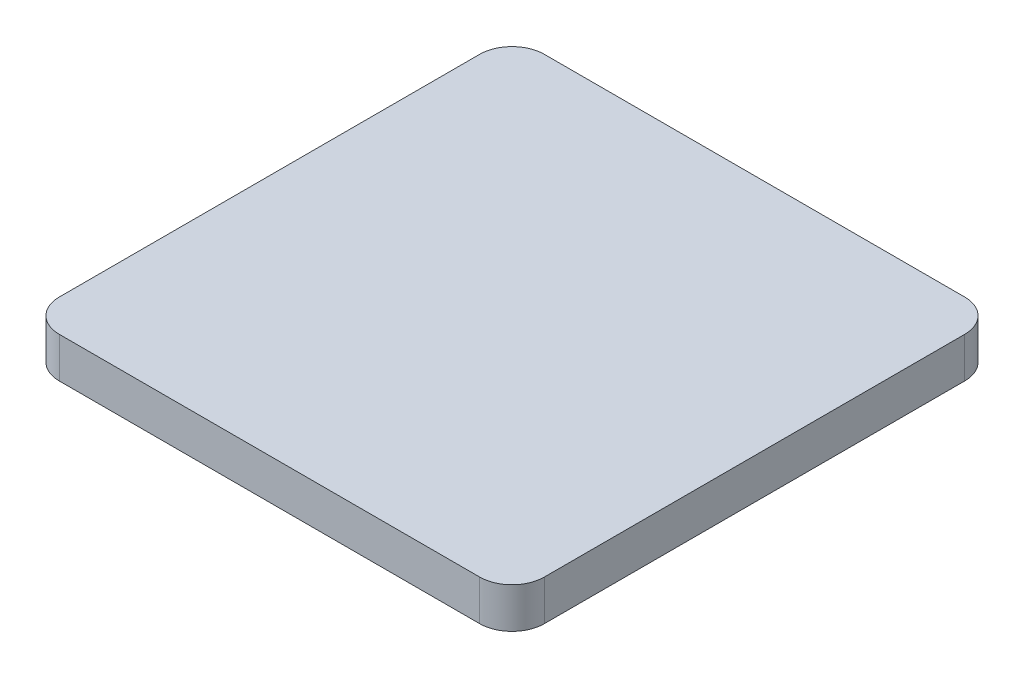
ISO-10303-21;
HEADER;
FILE_DESCRIPTION(('STEP AP214'),'2;1');
FILE_NAME('part.step','',(''),(''),'','','');
FILE_SCHEMA(('AUTOMOTIVE_DESIGN { 1 0 10303 214 1 1 1 1 }'));
ENDSEC;
DATA;
#1=APPLICATION_CONTEXT('core data for automotive mechanical design processes');
#2=APPLICATION_PROTOCOL_DEFINITION('international standard','automotive_design',2000,#1);
#3=PRODUCT_CONTEXT('',#1,'mechanical');
#4=PRODUCT('Part','Part','',(#3));
#5=PRODUCT_RELATED_PRODUCT_CATEGORY('part','',(#4));
#6=PRODUCT_DEFINITION_FORMATION('','',#4);
#7=PRODUCT_DEFINITION_CONTEXT('part definition',#1,'design');
#8=PRODUCT_DEFINITION('design','',#6,#7);
#9=PRODUCT_DEFINITION_SHAPE('','',#8);
#10=(LENGTH_UNIT() NAMED_UNIT(*) SI_UNIT(.MILLI.,.METRE.));
#11=(NAMED_UNIT(*) PLANE_ANGLE_UNIT() SI_UNIT($,.RADIAN.));
#12=(NAMED_UNIT(*) SI_UNIT($,.STERADIAN.) SOLID_ANGLE_UNIT());
#13=UNCERTAINTY_MEASURE_WITH_UNIT(LENGTH_MEASURE(1.E-05),#10,'distance_accuracy_value','');
#14=(GEOMETRIC_REPRESENTATION_CONTEXT(3) GLOBAL_UNCERTAINTY_ASSIGNED_CONTEXT((#13)) GLOBAL_UNIT_ASSIGNED_CONTEXT((#10,
#11,#12)) REPRESENTATION_CONTEXT('',''));
#15=CARTESIAN_POINT('',(0.,0.,0.));
#16=DIRECTION('',(0.,0.,1.));
#17=DIRECTION('',(1.,0.,0.));
#18=AXIS2_PLACEMENT_3D('',#15,#16,#17);
#19=CARTESIAN_POINT('',(-60.,10.,-60.));
#20=DIRECTION('',(1.,0.,0.));
#21=DIRECTION('',(0.,0.,-1.));
#22=AXIS2_PLACEMENT_3D('',#19,#20,#21);
#23=PLANE('',#22);
#24=DIRECTION('',(0.,0.,1.));
#25=VECTOR('',#24,1.);
#26=CARTESIAN_POINT('',(-60.,10.,-60.));
#27=LINE('',#26,#25);
#28=CARTESIAN_POINT('',(-60.,10.,-52.));
#29=VERTEX_POINT('',#28);
#30=CARTESIAN_POINT('',(-60.,10.,52.));
#31=VERTEX_POINT('',#30);
#32=EDGE_CURVE('E120',#29,#31,#27,.T.);
#33=ORIENTED_EDGE('',*,*,#32,.F.);
#34=DIRECTION('',(0.,-1.,0.));
#35=VECTOR('',#34,1.);
#36=CARTESIAN_POINT('',(-60.,10.,-52.));
#37=LINE('',#36,#35);
#38=CARTESIAN_POINT('',(-60.,0.,-52.));
#39=VERTEX_POINT('',#38);
#40=EDGE_CURVE('E105',#29,#39,#37,.T.);
#41=ORIENTED_EDGE('',*,*,#40,.T.);
#42=DIRECTION('',(0.,0.,1.));
#43=VECTOR('',#42,1.);
#44=CARTESIAN_POINT('',(-60.,0.,-60.));
#45=LINE('',#44,#43);
#46=CARTESIAN_POINT('',(-60.,0.,52.));
#47=VERTEX_POINT('',#46);
#48=EDGE_CURVE('E117',#39,#47,#45,.T.);
#49=ORIENTED_EDGE('',*,*,#48,.T.);
#50=DIRECTION('',(0.,-1.,0.));
#51=VECTOR('',#50,1.);
#52=CARTESIAN_POINT('',(-60.,10.,52.));
#53=LINE('',#52,#51);
#54=EDGE_CURVE('E122',#47,#31,#53,.F.);
#55=ORIENTED_EDGE('',*,*,#54,.T.);
#56=EDGE_LOOP('',(#33,#41,#49,#55));
#57=FACE_BOUND('',#56,.T.);
#58=ADVANCED_FACE('F35',(#57),#23,.F.);
#59=CARTESIAN_POINT('',(60.,10.,60.));
#60=DIRECTION('',(0.,0.,-1.));
#61=DIRECTION('',(-1.,0.,0.));
#62=AXIS2_PLACEMENT_3D('',#59,#60,#61);
#63=PLANE('',#62);
#64=DIRECTION('',(1.,0.,0.));
#65=VECTOR('',#64,1.);
#66=CARTESIAN_POINT('',(60.,0.,60.));
#67=LINE('',#66,#65);
#68=CARTESIAN_POINT('',(-52.,0.,60.));
#69=VERTEX_POINT('',#68);
#70=CARTESIAN_POINT('',(52.,0.,60.));
#71=VERTEX_POINT('',#70);
#72=EDGE_CURVE('E126',#69,#71,#67,.T.);
#73=ORIENTED_EDGE('',*,*,#72,.T.);
#74=DIRECTION('',(0.,-1.,0.));
#75=VECTOR('',#74,1.);
#76=CARTESIAN_POINT('',(52.,10.,60.));
#77=LINE('',#76,#75);
#78=CARTESIAN_POINT('',(52.,10.,60.));
#79=VERTEX_POINT('',#78);
#80=EDGE_CURVE('E11',#71,#79,#77,.F.);
#81=ORIENTED_EDGE('',*,*,#80,.T.);
#82=DIRECTION('',(1.,0.,0.));
#83=VECTOR('',#82,1.);
#84=CARTESIAN_POINT('',(60.,10.,60.));
#85=LINE('',#84,#83);
#86=CARTESIAN_POINT('',(-52.,10.,60.));
#87=VERTEX_POINT('',#86);
#88=EDGE_CURVE('E162',#87,#79,#85,.T.);
#89=ORIENTED_EDGE('',*,*,#88,.F.);
#90=DIRECTION('',(0.,-1.,0.));
#91=VECTOR('',#90,1.);
#92=CARTESIAN_POINT('',(-52.,10.,60.));
#93=LINE('',#92,#91);
#94=EDGE_CURVE('E43',#87,#69,#93,.T.);
#95=ORIENTED_EDGE('',*,*,#94,.T.);
#96=EDGE_LOOP('',(#73,#81,#89,#95));
#97=FACE_BOUND('',#96,.T.);
#98=ADVANCED_FACE('F160',(#97),#63,.F.);
#99=CARTESIAN_POINT('',(60.,10.,-60.));
#100=DIRECTION('',(-1.,0.,0.));
#101=DIRECTION('',(0.,0.,1.));
#102=AXIS2_PLACEMENT_3D('',#99,#100,#101);
#103=PLANE('',#102);
#104=DIRECTION('',(0.,0.,-1.));
#105=VECTOR('',#104,1.);
#106=CARTESIAN_POINT('',(60.,0.,-60.));
#107=LINE('',#106,#105);
#108=CARTESIAN_POINT('',(60.,0.,52.));
#109=VERTEX_POINT('',#108);
#110=CARTESIAN_POINT('',(60.,0.,-52.));
#111=VERTEX_POINT('',#110);
#112=EDGE_CURVE('E129',#109,#111,#107,.T.);
#113=ORIENTED_EDGE('',*,*,#112,.T.);
#114=DIRECTION('',(0.,-1.,0.));
#115=VECTOR('',#114,1.);
#116=CARTESIAN_POINT('',(60.,10.,-52.));
#117=LINE('',#116,#115);
#118=CARTESIAN_POINT('',(60.,10.,-52.));
#119=VERTEX_POINT('',#118);
#120=EDGE_CURVE('E50',#111,#119,#117,.F.);
#121=ORIENTED_EDGE('',*,*,#120,.T.);
#122=DIRECTION('',(0.,0.,-1.));
#123=VECTOR('',#122,1.);
#124=CARTESIAN_POINT('',(60.,10.,-60.));
#125=LINE('',#124,#123);
#126=CARTESIAN_POINT('',(60.,10.,52.));
#127=VERTEX_POINT('',#126);
#128=EDGE_CURVE('E170',#127,#119,#125,.T.);
#129=ORIENTED_EDGE('',*,*,#128,.F.);
#130=DIRECTION('',(0.,-1.,0.));
#131=VECTOR('',#130,1.);
#132=CARTESIAN_POINT('',(60.,10.,52.));
#133=LINE('',#132,#131);
#134=EDGE_CURVE('E153',#127,#109,#133,.T.);
#135=ORIENTED_EDGE('',*,*,#134,.T.);
#136=EDGE_LOOP('',(#113,#121,#129,#135));
#137=FACE_BOUND('',#136,.T.);
#138=ADVANCED_FACE('F169',(#137),#103,.F.);
#139=CARTESIAN_POINT('',(60.,10.,-60.));
#140=DIRECTION('',(0.,0.,1.));
#141=DIRECTION('',(1.,0.,0.));
#142=AXIS2_PLACEMENT_3D('',#139,#140,#141);
#143=PLANE('',#142);
#144=DIRECTION('',(-1.,0.,0.));
#145=VECTOR('',#144,1.);
#146=CARTESIAN_POINT('',(60.,0.,-60.));
#147=LINE('',#146,#145);
#148=CARTESIAN_POINT('',(52.,0.,-60.));
#149=VERTEX_POINT('',#148);
#150=CARTESIAN_POINT('',(-52.,0.,-60.));
#151=VERTEX_POINT('',#150);
#152=EDGE_CURVE('E136',#149,#151,#147,.T.);
#153=ORIENTED_EDGE('',*,*,#152,.T.);
#154=DIRECTION('',(0.,-1.,0.));
#155=VECTOR('',#154,1.);
#156=CARTESIAN_POINT('',(-52.,10.,-60.));
#157=LINE('',#156,#155);
#158=CARTESIAN_POINT('',(-52.,10.,-60.));
#159=VERTEX_POINT('',#158);
#160=EDGE_CURVE('E106',#151,#159,#157,.F.);
#161=ORIENTED_EDGE('',*,*,#160,.T.);
#162=DIRECTION('',(-1.,0.,0.));
#163=VECTOR('',#162,1.);
#164=CARTESIAN_POINT('',(60.,10.,-60.));
#165=LINE('',#164,#163);
#166=CARTESIAN_POINT('',(52.,10.,-60.));
#167=VERTEX_POINT('',#166);
#168=EDGE_CURVE('E132',#167,#159,#165,.T.);
#169=ORIENTED_EDGE('',*,*,#168,.F.);
#170=DIRECTION('',(0.,-1.,0.));
#171=VECTOR('',#170,1.);
#172=CARTESIAN_POINT('',(52.,10.,-60.));
#173=LINE('',#172,#171);
#174=EDGE_CURVE('E111',#167,#149,#173,.T.);
#175=ORIENTED_EDGE('',*,*,#174,.T.);
#176=EDGE_LOOP('',(#153,#161,#169,#175));
#177=FACE_BOUND('',#176,.T.);
#178=ADVANCED_FACE('F198',(#177),#143,.F.);
#179=CARTESIAN_POINT('',(0.,10.,0.));
#180=DIRECTION('',(0.,-1.,0.));
#181=DIRECTION('',(0.,0.,-1.));
#182=AXIS2_PLACEMENT_3D('',#179,#180,#181);
#183=PLANE('',#182);
#184=ORIENTED_EDGE('',*,*,#168,.T.);
#185=CARTESIAN_POINT('',(-52.,10.,-52.));
#186=DIRECTION('',(0.,-1.,0.));
#187=DIRECTION('',(0.,0.,-1.));
#188=AXIS2_PLACEMENT_3D('',#185,#186,#187);
#189=CIRCLE('',#188,8.);
#190=EDGE_CURVE('E151',#159,#29,#189,.F.);
#191=ORIENTED_EDGE('',*,*,#190,.T.);
#192=ORIENTED_EDGE('',*,*,#32,.T.);
#193=CARTESIAN_POINT('',(-52.,10.,52.));
#194=DIRECTION('',(0.,-1.,0.));
#195=DIRECTION('',(0.,0.,-1.));
#196=AXIS2_PLACEMENT_3D('',#193,#194,#195);
#197=CIRCLE('',#196,8.);
#198=EDGE_CURVE('E146',#31,#87,#197,.F.);
#199=ORIENTED_EDGE('',*,*,#198,.T.);
#200=ORIENTED_EDGE('',*,*,#88,.T.);
#201=CARTESIAN_POINT('',(52.,10.,52.));
#202=DIRECTION('',(0.,-1.,0.));
#203=DIRECTION('',(0.,0.,-1.));
#204=AXIS2_PLACEMENT_3D('',#201,#202,#203);
#205=CIRCLE('',#204,8.);
#206=EDGE_CURVE('E57',#79,#127,#205,.F.);
#207=ORIENTED_EDGE('',*,*,#206,.T.);
#208=ORIENTED_EDGE('',*,*,#128,.T.);
#209=CARTESIAN_POINT('',(52.,10.,-52.));
#210=DIRECTION('',(0.,-1.,0.));
#211=DIRECTION('',(0.,0.,-1.));
#212=AXIS2_PLACEMENT_3D('',#209,#210,#211);
#213=CIRCLE('',#212,8.);
#214=EDGE_CURVE('E149',#119,#167,#213,.F.);
#215=ORIENTED_EDGE('',*,*,#214,.T.);
#216=EDGE_LOOP('',(#184,#191,#192,#199,#200,#207,#208,#215));
#217=FACE_BOUND('',#216,.T.);
#218=ADVANCED_FACE('F175',(#217),#183,.F.);
#219=CARTESIAN_POINT('',(0.,0.,0.));
#220=DIRECTION('',(0.,-1.,0.));
#221=DIRECTION('',(0.,0.,-1.));
#222=AXIS2_PLACEMENT_3D('',#219,#220,#221);
#223=PLANE('',#222);
#224=ORIENTED_EDGE('',*,*,#48,.F.);
#225=CARTESIAN_POINT('',(-52.,0.,-52.));
#226=DIRECTION('',(0.,-1.,0.));
#227=DIRECTION('',(0.,0.,-1.));
#228=AXIS2_PLACEMENT_3D('',#225,#226,#227);
#229=CIRCLE('',#228,8.);
#230=EDGE_CURVE('E101',#39,#151,#229,.T.);
#231=ORIENTED_EDGE('',*,*,#230,.T.);
#232=ORIENTED_EDGE('',*,*,#152,.F.);
#233=CARTESIAN_POINT('',(52.,0.,-52.));
#234=DIRECTION('',(0.,-1.,0.));
#235=DIRECTION('',(0.,0.,-1.));
#236=AXIS2_PLACEMENT_3D('',#233,#234,#235);
#237=CIRCLE('',#236,8.);
#238=EDGE_CURVE('E112',#149,#111,#237,.T.);
#239=ORIENTED_EDGE('',*,*,#238,.T.);
#240=ORIENTED_EDGE('',*,*,#112,.F.);
#241=CARTESIAN_POINT('',(52.,0.,52.));
#242=DIRECTION('',(0.,-1.,0.));
#243=DIRECTION('',(0.,0.,-1.));
#244=AXIS2_PLACEMENT_3D('',#241,#242,#243);
#245=CIRCLE('',#244,8.);
#246=EDGE_CURVE('E140',#109,#71,#245,.T.);
#247=ORIENTED_EDGE('',*,*,#246,.T.);
#248=ORIENTED_EDGE('',*,*,#72,.F.);
#249=CARTESIAN_POINT('',(-52.,0.,52.));
#250=DIRECTION('',(0.,-1.,0.));
#251=DIRECTION('',(0.,0.,-1.));
#252=AXIS2_PLACEMENT_3D('',#249,#250,#251);
#253=CIRCLE('',#252,8.);
#254=EDGE_CURVE('E121',#69,#47,#253,.T.);
#255=ORIENTED_EDGE('',*,*,#254,.T.);
#256=EDGE_LOOP('',(#224,#231,#232,#239,#240,#247,#248,#255));
#257=FACE_BOUND('',#256,.T.);
#258=ADVANCED_FACE('F124',(#257),#223,.T.);
#259=CARTESIAN_POINT('',(-52.,10.,-52.));
#260=DIRECTION('',(0.,-1.,0.));
#261=DIRECTION('',(0.,0.,-1.));
#262=AXIS2_PLACEMENT_3D('',#259,#260,#261);
#263=CYLINDRICAL_SURFACE('',#262,8.);
#264=ORIENTED_EDGE('',*,*,#190,.F.);
#265=ORIENTED_EDGE('',*,*,#160,.F.);
#266=ORIENTED_EDGE('',*,*,#230,.F.);
#267=ORIENTED_EDGE('',*,*,#40,.F.);
#268=EDGE_LOOP('',(#264,#265,#266,#267));
#269=FACE_BOUND('',#268,.T.);
#270=ADVANCED_FACE('F104',(#269),#263,.T.);
#271=CARTESIAN_POINT('',(52.,10.,-52.));
#272=DIRECTION('',(0.,-1.,0.));
#273=DIRECTION('',(0.,0.,-1.));
#274=AXIS2_PLACEMENT_3D('',#271,#272,#273);
#275=CYLINDRICAL_SURFACE('',#274,8.);
#276=ORIENTED_EDGE('',*,*,#214,.F.);
#277=ORIENTED_EDGE('',*,*,#120,.F.);
#278=ORIENTED_EDGE('',*,*,#238,.F.);
#279=ORIENTED_EDGE('',*,*,#174,.F.);
#280=EDGE_LOOP('',(#276,#277,#278,#279));
#281=FACE_BOUND('',#280,.T.);
#282=ADVANCED_FACE('F180',(#281),#275,.T.);
#283=CARTESIAN_POINT('',(52.,10.,52.));
#284=DIRECTION('',(0.,-1.,0.));
#285=DIRECTION('',(0.,0.,-1.));
#286=AXIS2_PLACEMENT_3D('',#283,#284,#285);
#287=CYLINDRICAL_SURFACE('',#286,8.);
#288=ORIENTED_EDGE('',*,*,#206,.F.);
#289=ORIENTED_EDGE('',*,*,#80,.F.);
#290=ORIENTED_EDGE('',*,*,#246,.F.);
#291=ORIENTED_EDGE('',*,*,#134,.F.);
#292=EDGE_LOOP('',(#288,#289,#290,#291));
#293=FACE_BOUND('',#292,.T.);
#294=ADVANCED_FACE('F168',(#293),#287,.T.);
#295=CARTESIAN_POINT('',(-52.,10.,52.));
#296=DIRECTION('',(0.,-1.,0.));
#297=DIRECTION('',(0.,0.,-1.));
#298=AXIS2_PLACEMENT_3D('',#295,#296,#297);
#299=CYLINDRICAL_SURFACE('',#298,8.);
#300=ORIENTED_EDGE('',*,*,#198,.F.);
#301=ORIENTED_EDGE('',*,*,#54,.F.);
#302=ORIENTED_EDGE('',*,*,#254,.F.);
#303=ORIENTED_EDGE('',*,*,#94,.F.);
#304=EDGE_LOOP('',(#300,#301,#302,#303));
#305=FACE_BOUND('',#304,.T.);
#306=ADVANCED_FACE('F37',(#305),#299,.T.);
#307=CLOSED_SHELL('',(#58,#98,#138,#178,#218,#258,#270,#282,#294,#306));
#308=MANIFOLD_SOLID_BREP('B2',#307);
#309=ADVANCED_BREP_SHAPE_REPRESENTATION('',(#18,#308),#14);
#310=SHAPE_DEFINITION_REPRESENTATION(#9,#309);
ENDSEC;
END-ISO-10303-21;
